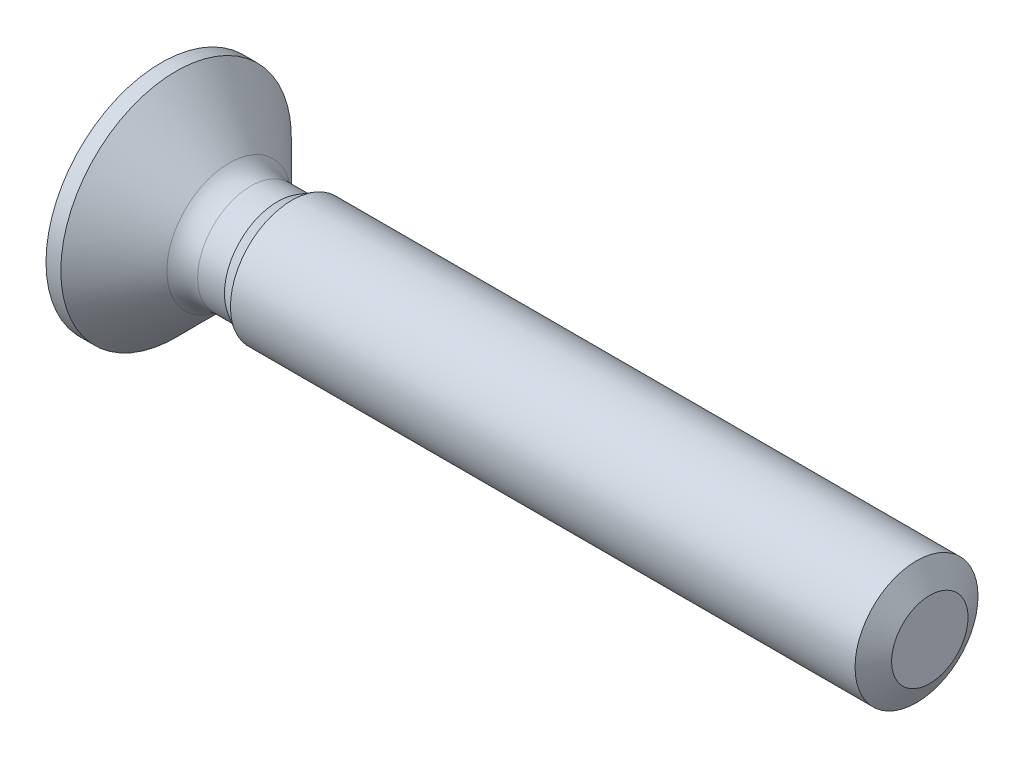
ISO-10303-21;
HEADER;
FILE_DESCRIPTION(('STEP AP214'),'2;1');
FILE_NAME('part.step','',(''),(''),'','','');
FILE_SCHEMA(('AUTOMOTIVE_DESIGN { 1 0 10303 214 1 1 1 1 }'));
ENDSEC;
DATA;
#1=APPLICATION_CONTEXT('core data for automotive mechanical design processes');
#2=APPLICATION_PROTOCOL_DEFINITION('international standard','automotive_design',2000,#1);
#3=PRODUCT_CONTEXT('',#1,'mechanical');
#4=PRODUCT('Part','Part','',(#3));
#5=PRODUCT_RELATED_PRODUCT_CATEGORY('part','',(#4));
#6=PRODUCT_DEFINITION_FORMATION('','',#4);
#7=PRODUCT_DEFINITION_CONTEXT('part definition',#1,'design');
#8=PRODUCT_DEFINITION('design','',#6,#7);
#9=PRODUCT_DEFINITION_SHAPE('','',#8);
#10=(LENGTH_UNIT() NAMED_UNIT(*) SI_UNIT(.MILLI.,.METRE.));
#11=(NAMED_UNIT(*) PLANE_ANGLE_UNIT() SI_UNIT($,.RADIAN.));
#12=(NAMED_UNIT(*) SI_UNIT($,.STERADIAN.) SOLID_ANGLE_UNIT());
#13=UNCERTAINTY_MEASURE_WITH_UNIT(LENGTH_MEASURE(1.E-05),#10,'distance_accuracy_value','');
#14=(GEOMETRIC_REPRESENTATION_CONTEXT(3) GLOBAL_UNCERTAINTY_ASSIGNED_CONTEXT((#13)) GLOBAL_UNIT_ASSIGNED_CONTEXT((#10,
#11,#12)) REPRESENTATION_CONTEXT('',''));
#15=CARTESIAN_POINT('',(0.,0.,0.));
#16=DIRECTION('',(0.,0.,1.));
#17=DIRECTION('',(1.,0.,0.));
#18=AXIS2_PLACEMENT_3D('',#15,#16,#17);
#19=CARTESIAN_POINT('',(0.,0.,0.));
#20=DIRECTION('',(1.,0.,0.));
#21=DIRECTION('',(0.,0.,-1.));
#22=AXIS2_PLACEMENT_3D('',#19,#20,#21);
#23=PLANE('',#22);
#24=CARTESIAN_POINT('',(0.,0.,0.));
#25=DIRECTION('',(-1.,0.,0.));
#26=DIRECTION('',(0.,0.,1.));
#27=AXIS2_PLACEMENT_3D('',#24,#25,#26);
#28=CIRCLE('',#27,1.5);
#29=CARTESIAN_POINT('',(0.,0.,1.5));
#30=VERTEX_POINT('',#29);
#31=EDGE_CURVE('E182',#30,#30,#28,.T.);
#32=ORIENTED_EDGE('',*,*,#31,.T.);
#33=EDGE_LOOP('',(#32));
#34=FACE_BOUND('',#33,.T.);
#35=DIRECTION('',(0.,1.,0.));
#36=VECTOR('',#35,1.);
#37=CARTESIAN_POINT('',(0.,0.799999999999999,0.175000000000003));
#38=LINE('',#37,#36);
#39=CARTESIAN_POINT('',(0.,0.175,0.175000000000001));
#40=VERTEX_POINT('',#39);
#41=CARTESIAN_POINT('',(0.,0.799999999999999,0.175000000000003));
#42=VERTEX_POINT('',#41);
#43=EDGE_CURVE('E104',#40,#42,#38,.T.);
#44=ORIENTED_EDGE('',*,*,#43,.F.);
#45=DIRECTION('',(0.,0.,-1.));
#46=VECTOR('',#45,1.);
#47=CARTESIAN_POINT('',(0.,0.175,-0.8));
#48=LINE('',#47,#46);
#49=CARTESIAN_POINT('',(0.,0.175,0.8));
#50=VERTEX_POINT('',#49);
#51=EDGE_CURVE('E149',#50,#40,#48,.T.);
#52=ORIENTED_EDGE('',*,*,#51,.F.);
#53=DIRECTION('',(0.,1.,0.));
#54=VECTOR('',#53,1.);
#55=CARTESIAN_POINT('',(0.,0.175,0.8));
#56=LINE('',#55,#54);
#57=CARTESIAN_POINT('',(0.,-0.175,0.8));
#58=VERTEX_POINT('',#57);
#59=EDGE_CURVE('E146',#58,#50,#56,.T.);
#60=ORIENTED_EDGE('',*,*,#59,.F.);
#61=DIRECTION('',(0.,0.,1.));
#62=VECTOR('',#61,1.);
#63=CARTESIAN_POINT('',(0.,-0.175,-0.8));
#64=LINE('',#63,#62);
#65=CARTESIAN_POINT('',(0.,-0.175,0.174999999999999));
#66=VERTEX_POINT('',#65);
#67=EDGE_CURVE('E77',#66,#58,#64,.T.);
#68=ORIENTED_EDGE('',*,*,#67,.F.);
#69=CARTESIAN_POINT('',(0.,-0.800000000000001,0.174999999999997));
#70=VERTEX_POINT('',#69);
#71=EDGE_CURVE('E112',#70,#66,#38,.T.);
#72=ORIENTED_EDGE('',*,*,#71,.F.);
#73=DIRECTION('',(0.,0.,1.));
#74=VECTOR('',#73,1.);
#75=CARTESIAN_POINT('',(0.,-0.800000000000001,0.174999999999997));
#76=LINE('',#75,#74);
#77=CARTESIAN_POINT('',(0.,-0.799999999999999,-0.175000000000003));
#78=VERTEX_POINT('',#77);
#79=EDGE_CURVE('E113',#78,#70,#76,.T.);
#80=ORIENTED_EDGE('',*,*,#79,.F.);
#81=DIRECTION('',(0.,-1.,0.));
#82=VECTOR('',#81,1.);
#83=CARTESIAN_POINT('',(0.,0.800000000000001,-0.174999999999997));
#84=LINE('',#83,#82);
#85=CARTESIAN_POINT('',(0.,-0.175,-0.175000000000001));
#86=VERTEX_POINT('',#85);
#87=EDGE_CURVE('E126',#86,#78,#84,.T.);
#88=ORIENTED_EDGE('',*,*,#87,.F.);
#89=CARTESIAN_POINT('',(0.,-0.175,-0.8));
#90=VERTEX_POINT('',#89);
#91=EDGE_CURVE('E143',#90,#86,#64,.T.);
#92=ORIENTED_EDGE('',*,*,#91,.F.);
#93=DIRECTION('',(0.,-1.,0.));
#94=VECTOR('',#93,1.);
#95=CARTESIAN_POINT('',(0.,0.175,-0.8));
#96=LINE('',#95,#94);
#97=CARTESIAN_POINT('',(0.,0.175,-0.8));
#98=VERTEX_POINT('',#97);
#99=EDGE_CURVE('E54',#98,#90,#96,.T.);
#100=ORIENTED_EDGE('',*,*,#99,.F.);
#101=CARTESIAN_POINT('',(0.,0.175,-0.174999999999999));
#102=VERTEX_POINT('',#101);
#103=EDGE_CURVE('E152',#102,#98,#48,.T.);
#104=ORIENTED_EDGE('',*,*,#103,.F.);
#105=CARTESIAN_POINT('',(0.,0.800000000000001,-0.174999999999997));
#106=VERTEX_POINT('',#105);
#107=EDGE_CURVE('E125',#106,#102,#84,.T.);
#108=ORIENTED_EDGE('',*,*,#107,.F.);
#109=DIRECTION('',(0.,0.,-1.));
#110=VECTOR('',#109,1.);
#111=CARTESIAN_POINT('',(0.,0.799999999999999,0.175000000000003));
#112=LINE('',#111,#110);
#113=EDGE_CURVE('E118',#42,#106,#112,.T.);
#114=ORIENTED_EDGE('',*,*,#113,.F.);
#115=EDGE_LOOP('',(#44,#52,#60,#68,#72,#80,#88,#92,#100,#104,#108,#114));
#116=FACE_BOUND('',#115,.T.);
#117=ADVANCED_FACE('F40',(#34,#116),#23,.F.);
#118=CARTESIAN_POINT('',(0.9,0.,0.));
#119=DIRECTION('',(-0.190869659102224,-0.981615389668581,0.));
#120=DIRECTION('',(0.981615389668581,-0.190869659102224,0.));
#121=AXIS2_PLACEMENT_3D('',#118,#119,#120);
#122=PLANE('',#121);
#123=ORIENTED_EDGE('',*,*,#51,.T.);
#124=DIRECTION('',(0.964208851210044,-0.187485054401953,-0.187485054401954));
#125=VECTOR('',#124,1.);
#126=CARTESIAN_POINT('',(0.9,0.,0.));
#127=LINE('',#126,#125);
#128=CARTESIAN_POINT('',(0.9,0.,0.));
#129=VERTEX_POINT('',#128);
#130=EDGE_CURVE('E83',#40,#129,#127,.T.);
#131=ORIENTED_EDGE('',*,*,#130,.T.);
#132=DIRECTION('',(0.739639285522949,-0.143818749962796,-0.657457142687066));
#133=VECTOR('',#132,1.);
#134=CARTESIAN_POINT('',(0.,0.175,0.8));
#135=LINE('',#134,#133);
#136=EDGE_CURVE('E63',#50,#129,#135,.T.);
#137=ORIENTED_EDGE('',*,*,#136,.F.);
#138=EDGE_LOOP('',(#123,#131,#137));
#139=FACE_BOUND('',#138,.T.);
#140=ADVANCED_FACE('F198',(#139),#122,.T.);
#141=DIRECTION('',(0.739639285522949,-0.143818749962796,0.657457142687066));
#142=VECTOR('',#141,1.);
#143=CARTESIAN_POINT('',(0.,0.175,-0.8));
#144=LINE('',#143,#142);
#145=EDGE_CURVE('E148',#98,#129,#144,.T.);
#146=ORIENTED_EDGE('',*,*,#145,.T.);
#147=DIRECTION('',(-0.964208851210045,0.187485054401953,-0.187485054401952));
#148=VECTOR('',#147,1.);
#149=CARTESIAN_POINT('',(0.9,0.,0.));
#150=LINE('',#149,#148);
#151=EDGE_CURVE('E130',#129,#102,#150,.T.);
#152=ORIENTED_EDGE('',*,*,#151,.T.);
#153=ORIENTED_EDGE('',*,*,#103,.T.);
#154=EDGE_LOOP('',(#146,#152,#153));
#155=FACE_BOUND('',#154,.T.);
#156=ADVANCED_FACE('F192',(#155),#122,.T.);
#157=CARTESIAN_POINT('',(0.9,0.,0.));
#158=DIRECTION('',(-0.190869659102224,0.981615389668581,0.));
#159=DIRECTION('',(-0.981615389668581,-0.190869659102224,0.));
#160=AXIS2_PLACEMENT_3D('',#157,#158,#159);
#161=PLANE('',#160);
#162=DIRECTION('',(0.739639285522949,0.143818749962796,-0.657457142687066));
#163=VECTOR('',#162,1.);
#164=CARTESIAN_POINT('',(0.,-0.175,0.8));
#165=LINE('',#164,#163);
#166=EDGE_CURVE('E142',#58,#129,#165,.T.);
#167=ORIENTED_EDGE('',*,*,#166,.T.);
#168=DIRECTION('',(-0.964208851210045,-0.187485054401953,0.187485054401952));
#169=VECTOR('',#168,1.);
#170=CARTESIAN_POINT('',(0.9,0.,0.));
#171=LINE('',#170,#169);
#172=EDGE_CURVE('E11',#129,#66,#171,.T.);
#173=ORIENTED_EDGE('',*,*,#172,.T.);
#174=ORIENTED_EDGE('',*,*,#67,.T.);
#175=EDGE_LOOP('',(#167,#173,#174));
#176=FACE_BOUND('',#175,.T.);
#177=ADVANCED_FACE('F193',(#176),#161,.T.);
#178=ORIENTED_EDGE('',*,*,#91,.T.);
#179=DIRECTION('',(0.964208851210044,0.187485054401953,0.187485054401954));
#180=VECTOR('',#179,1.);
#181=CARTESIAN_POINT('',(0.9,0.,0.));
#182=LINE('',#181,#180);
#183=EDGE_CURVE('E47',#86,#129,#182,.T.);
#184=ORIENTED_EDGE('',*,*,#183,.T.);
#185=DIRECTION('',(0.739639285522949,0.143818749962796,0.657457142687066));
#186=VECTOR('',#185,1.);
#187=CARTESIAN_POINT('',(0.,-0.175,-0.8));
#188=LINE('',#187,#186);
#189=EDGE_CURVE('E157',#90,#129,#188,.T.);
#190=ORIENTED_EDGE('',*,*,#189,.F.);
#191=EDGE_LOOP('',(#178,#184,#190));
#192=FACE_BOUND('',#191,.T.);
#193=ADVANCED_FACE('F186',(#192),#161,.T.);
#194=CARTESIAN_POINT('',(0.,0.,0.));
#195=DIRECTION('',(-1.,0.,0.));
#196=DIRECTION('',(0.,0.,1.));
#197=AXIS2_PLACEMENT_3D('',#194,#195,#196);
#198=CYLINDRICAL_SURFACE('',#197,1.5);
#199=ORIENTED_EDGE('',*,*,#31,.F.);
#200=EDGE_LOOP('',(#199));
#201=FACE_BOUND('',#200,.T.);
#202=CARTESIAN_POINT('',(0.192800000000003,0.,0.));
#203=DIRECTION('',(-1.,0.,0.));
#204=DIRECTION('',(0.,0.,1.));
#205=AXIS2_PLACEMENT_3D('',#202,#203,#204);
#206=CIRCLE('',#205,1.5);
#207=CARTESIAN_POINT('',(0.192800000000003,0.,1.5));
#208=VERTEX_POINT('',#207);
#209=EDGE_CURVE('E178',#208,#208,#206,.T.);
#210=ORIENTED_EDGE('',*,*,#209,.T.);
#211=EDGE_LOOP('',(#210));
#212=FACE_BOUND('',#211,.T.);
#213=ADVANCED_FACE('F226',(#201,#212),#198,.T.);
#214=CARTESIAN_POINT('',(0.882842712474619,0.,0.));
#215=DIRECTION('',(-1.,0.,0.));
#216=DIRECTION('',(0.,0.,1.));
#217=AXIS2_PLACEMENT_3D('',#214,#215,#216);
#218=CONICAL_SURFACE('',#217,0.809957287525381,0.78539816339745);
#219=ORIENTED_EDGE('',*,*,#209,.F.);
#220=EDGE_LOOP('',(#219));
#221=FACE_BOUND('',#220,.T.);
#222=CARTESIAN_POINT('',(0.882842712474619,0.,0.));
#223=DIRECTION('',(-1.,0.,0.));
#224=DIRECTION('',(0.,0.,1.));
#225=AXIS2_PLACEMENT_3D('',#222,#223,#224);
#226=CIRCLE('',#225,0.809957287525381);
#227=CARTESIAN_POINT('',(0.882842712474619,0.,0.809957287525381));
#228=VERTEX_POINT('',#227);
#229=EDGE_CURVE('E174',#228,#228,#226,.T.);
#230=ORIENTED_EDGE('',*,*,#229,.T.);
#231=EDGE_LOOP('',(#230));
#232=FACE_BOUND('',#231,.T.);
#233=ADVANCED_FACE('F229',(#221,#232),#218,.T.);
#234=CARTESIAN_POINT('',(1.16568542494924,0.,0.));
#235=DIRECTION('',(-1.,0.,0.));
#236=DIRECTION('',(0.,0.,1.));
#237=AXIS2_PLACEMENT_3D('',#234,#235,#236);
#238=TOROIDAL_SURFACE('',#237,1.0928,0.4);
#239=ORIENTED_EDGE('',*,*,#229,.F.);
#240=EDGE_LOOP('',(#239));
#241=FACE_BOUND('',#240,.T.);
#242=CARTESIAN_POINT('',(1.16568542494924,0.,0.));
#243=DIRECTION('',(-1.,0.,0.));
#244=DIRECTION('',(0.,0.,1.));
#245=AXIS2_PLACEMENT_3D('',#242,#243,#244);
#246=CIRCLE('',#245,0.6928);
#247=CARTESIAN_POINT('',(1.16568542494924,0.,0.6928));
#248=VERTEX_POINT('',#247);
#249=EDGE_CURVE('E171',#248,#248,#246,.T.);
#250=ORIENTED_EDGE('',*,*,#249,.T.);
#251=EDGE_LOOP('',(#250));
#252=FACE_BOUND('',#251,.T.);
#253=ADVANCED_FACE('F234',(#241,#252),#238,.F.);
#254=CARTESIAN_POINT('',(0.,0.,0.));
#255=DIRECTION('',(-1.,0.,0.));
#256=DIRECTION('',(0.,0.,1.));
#257=AXIS2_PLACEMENT_3D('',#254,#255,#256);
#258=CYLINDRICAL_SURFACE('',#257,0.6928);
#259=ORIENTED_EDGE('',*,*,#249,.F.);
#260=EDGE_LOOP('',(#259));
#261=FACE_BOUND('',#260,.T.);
#262=CARTESIAN_POINT('',(1.51432415342862,0.,0.));
#263=DIRECTION('',(-1.,0.,0.));
#264=DIRECTION('',(0.,0.,1.));
#265=AXIS2_PLACEMENT_3D('',#262,#263,#264);
#266=CIRCLE('',#265,0.6928);
#267=CARTESIAN_POINT('',(1.51432415342862,0.,0.6928));
#268=VERTEX_POINT('',#267);
#269=EDGE_CURVE('E168',#268,#268,#266,.T.);
#270=ORIENTED_EDGE('',*,*,#269,.T.);
#271=EDGE_LOOP('',(#270));
#272=FACE_BOUND('',#271,.T.);
#273=ADVANCED_FACE('F240',(#261,#272),#258,.T.);
#274=CARTESIAN_POINT('',(1.7,0.,0.));
#275=DIRECTION('',(1.,0.,0.));
#276=DIRECTION('',(0.,0.,-1.));
#277=AXIS2_PLACEMENT_3D('',#274,#275,#276);
#278=CONICAL_SURFACE('',#277,0.8,0.5235987755983);
#279=ORIENTED_EDGE('',*,*,#269,.F.);
#280=EDGE_LOOP('',(#279));
#281=FACE_BOUND('',#280,.T.);
#282=CARTESIAN_POINT('',(1.7,0.,0.));
#283=DIRECTION('',(-1.,0.,0.));
#284=DIRECTION('',(0.,0.,1.));
#285=AXIS2_PLACEMENT_3D('',#282,#283,#284);
#286=CIRCLE('',#285,0.8);
#287=CARTESIAN_POINT('',(1.7,0.,0.8));
#288=VERTEX_POINT('',#287);
#289=EDGE_CURVE('E165',#288,#288,#286,.T.);
#290=ORIENTED_EDGE('',*,*,#289,.T.);
#291=EDGE_LOOP('',(#290));
#292=FACE_BOUND('',#291,.T.);
#293=ADVANCED_FACE('F246',(#281,#292),#278,.T.);
#294=CARTESIAN_POINT('',(0.,0.,0.));
#295=DIRECTION('',(-1.,0.,0.));
#296=DIRECTION('',(0.,0.,1.));
#297=AXIS2_PLACEMENT_3D('',#294,#295,#296);
#298=CYLINDRICAL_SURFACE('',#297,0.8);
#299=CARTESIAN_POINT('',(9.8268956020098,0.,0.));
#300=DIRECTION('',(1.,0.,0.));
#301=DIRECTION('',(0.,0.,-1.));
#302=AXIS2_PLACEMENT_3D('',#299,#300,#301);
#303=CIRCLE('',#302,0.799999999999999);
#304=CARTESIAN_POINT('',(9.8268956020098,0.,-0.799999999999999));
#305=VERTEX_POINT('',#304);
#306=EDGE_CURVE('E162',#305,#305,#303,.T.);
#307=ORIENTED_EDGE('',*,*,#306,.F.);
#308=EDGE_LOOP('',(#307));
#309=FACE_BOUND('',#308,.T.);
#310=ORIENTED_EDGE('',*,*,#289,.F.);
#311=EDGE_LOOP('',(#310));
#312=FACE_BOUND('',#311,.T.);
#313=ADVANCED_FACE('F252',(#309,#312),#298,.T.);
#314=CARTESIAN_POINT('',(9.8268956020098,0.,0.));
#315=DIRECTION('',(-1.,0.,0.));
#316=DIRECTION('',(0.,0.,1.));
#317=AXIS2_PLACEMENT_3D('',#314,#315,#316);
#318=CONICAL_SURFACE('',#317,0.799999999999999,1.05188801855118);
#319=CARTESIAN_POINT('',(10.,0.,0.));
#320=DIRECTION('',(1.,0.,0.));
#321=DIRECTION('',(0.,0.,-1.));
#322=AXIS2_PLACEMENT_3D('',#319,#320,#321);
#323=CIRCLE('',#322,0.496899999999999);
#324=CARTESIAN_POINT('',(10.,0.,-0.496899999999999));
#325=VERTEX_POINT('',#324);
#326=EDGE_CURVE('E151',#325,#325,#323,.T.);
#327=ORIENTED_EDGE('',*,*,#326,.F.);
#328=EDGE_LOOP('',(#327));
#329=FACE_BOUND('',#328,.T.);
#330=ORIENTED_EDGE('',*,*,#306,.T.);
#331=EDGE_LOOP('',(#330));
#332=FACE_BOUND('',#331,.T.);
#333=ADVANCED_FACE('F257',(#329,#332),#318,.T.);
#334=CARTESIAN_POINT('',(10.,0.8,0.));
#335=DIRECTION('',(-1.,0.,0.));
#336=DIRECTION('',(0.,0.,1.));
#337=AXIS2_PLACEMENT_3D('',#334,#335,#336);
#338=PLANE('',#337);
#339=ORIENTED_EDGE('',*,*,#326,.T.);
#340=EDGE_LOOP('',(#339));
#341=FACE_BOUND('',#340,.T.);
#342=ADVANCED_FACE('F263',(#341),#338,.F.);
#343=CARTESIAN_POINT('',(0.,0.175,-0.8));
#344=DIRECTION('',(0.66436383882992,0.,-0.74740931868366));
#345=DIRECTION('',(-0.74740931868366,0.,-0.66436383882992));
#346=AXIS2_PLACEMENT_3D('',#343,#344,#345);
#347=PLANE('',#346);
#348=ORIENTED_EDGE('',*,*,#145,.F.);
#349=ORIENTED_EDGE('',*,*,#99,.T.);
#350=ORIENTED_EDGE('',*,*,#189,.T.);
#351=EDGE_LOOP('',(#348,#349,#350));
#352=FACE_BOUND('',#351,.T.);
#353=ADVANCED_FACE('F190',(#352),#347,.F.);
#354=CARTESIAN_POINT('',(0.,-0.175,0.8));
#355=DIRECTION('',(0.66436383882992,0.,0.74740931868366));
#356=DIRECTION('',(0.74740931868366,0.,-0.66436383882992));
#357=AXIS2_PLACEMENT_3D('',#354,#355,#356);
#358=PLANE('',#357);
#359=ORIENTED_EDGE('',*,*,#166,.F.);
#360=ORIENTED_EDGE('',*,*,#59,.T.);
#361=ORIENTED_EDGE('',*,*,#136,.T.);
#362=EDGE_LOOP('',(#359,#360,#361));
#363=FACE_BOUND('',#362,.T.);
#364=ADVANCED_FACE('F197',(#363),#358,.F.);
#365=CARTESIAN_POINT('',(0.9,0.,0.));
#366=DIRECTION('',(-0.190869659102224,0.,-0.981615389668581));
#367=DIRECTION('',(0.981615389668581,0.,-0.190869659102224));
#368=AXIS2_PLACEMENT_3D('',#365,#366,#367);
#369=PLANE('',#368);
#370=DIRECTION('',(0.739639285522949,0.657457142687066,-0.143818749962793));
#371=VECTOR('',#370,1.);
#372=CARTESIAN_POINT('',(0.,-0.800000000000001,0.174999999999997));
#373=LINE('',#372,#371);
#374=EDGE_CURVE('E122',#70,#129,#373,.T.);
#375=ORIENTED_EDGE('',*,*,#374,.F.);
#376=ORIENTED_EDGE('',*,*,#71,.T.);
#377=ORIENTED_EDGE('',*,*,#172,.F.);
#378=EDGE_LOOP('',(#375,#376,#377));
#379=FACE_BOUND('',#378,.T.);
#380=ADVANCED_FACE('F202',(#379),#369,.T.);
#381=CARTESIAN_POINT('',(0.9,0.,0.));
#382=DIRECTION('',(-0.190869659102224,0.,0.981615389668581));
#383=DIRECTION('',(-0.981615389668581,0.,-0.190869659102224));
#384=AXIS2_PLACEMENT_3D('',#381,#382,#383);
#385=PLANE('',#384);
#386=ORIENTED_EDGE('',*,*,#87,.T.);
#387=DIRECTION('',(0.739639285522949,0.657457142687065,0.143818749962798));
#388=VECTOR('',#387,1.);
#389=CARTESIAN_POINT('',(0.,-0.799999999999999,-0.175000000000003));
#390=LINE('',#389,#388);
#391=EDGE_CURVE('E136',#78,#129,#390,.T.);
#392=ORIENTED_EDGE('',*,*,#391,.T.);
#393=ORIENTED_EDGE('',*,*,#183,.F.);
#394=EDGE_LOOP('',(#386,#392,#393));
#395=FACE_BOUND('',#394,.T.);
#396=ADVANCED_FACE('F206',(#395),#385,.T.);
#397=CARTESIAN_POINT('',(0.,-0.799999999999999,-0.175000000000003));
#398=DIRECTION('',(0.66436383882992,-0.74740931868366,0.));
#399=DIRECTION('',(0.74740931868366,0.66436383882992,0.));
#400=AXIS2_PLACEMENT_3D('',#397,#398,#399);
#401=PLANE('',#400);
#402=ORIENTED_EDGE('',*,*,#391,.F.);
#403=ORIENTED_EDGE('',*,*,#79,.T.);
#404=ORIENTED_EDGE('',*,*,#374,.T.);
#405=EDGE_LOOP('',(#402,#403,#404));
#406=FACE_BOUND('',#405,.T.);
#407=ADVANCED_FACE('F205',(#406),#401,.F.);
#408=ORIENTED_EDGE('',*,*,#43,.T.);
#409=DIRECTION('',(0.739639285522949,-0.657457142687065,-0.143818749962798));
#410=VECTOR('',#409,1.);
#411=CARTESIAN_POINT('',(0.,0.799999999999999,0.175000000000003));
#412=LINE('',#411,#410);
#413=EDGE_CURVE('E107',#42,#129,#412,.T.);
#414=ORIENTED_EDGE('',*,*,#413,.T.);
#415=ORIENTED_EDGE('',*,*,#130,.F.);
#416=EDGE_LOOP('',(#408,#414,#415));
#417=FACE_BOUND('',#416,.T.);
#418=ADVANCED_FACE('F106',(#417),#369,.T.);
#419=DIRECTION('',(0.739639285522949,-0.657457142687066,0.143818749962793));
#420=VECTOR('',#419,1.);
#421=CARTESIAN_POINT('',(0.,0.800000000000001,-0.174999999999997));
#422=LINE('',#421,#420);
#423=EDGE_CURVE('E120',#106,#129,#422,.T.);
#424=ORIENTED_EDGE('',*,*,#423,.F.);
#425=ORIENTED_EDGE('',*,*,#107,.T.);
#426=ORIENTED_EDGE('',*,*,#151,.F.);
#427=EDGE_LOOP('',(#424,#425,#426));
#428=FACE_BOUND('',#427,.T.);
#429=ADVANCED_FACE('F209',(#428),#385,.T.);
#430=CARTESIAN_POINT('',(0.,0.799999999999999,0.175000000000003));
#431=DIRECTION('',(0.66436383882992,0.74740931868366,0.));
#432=DIRECTION('',(-0.74740931868366,0.66436383882992,0.));
#433=AXIS2_PLACEMENT_3D('',#430,#431,#432);
#434=PLANE('',#433);
#435=ORIENTED_EDGE('',*,*,#413,.F.);
#436=ORIENTED_EDGE('',*,*,#113,.T.);
#437=ORIENTED_EDGE('',*,*,#423,.T.);
#438=EDGE_LOOP('',(#435,#436,#437));
#439=FACE_BOUND('',#438,.T.);
#440=ADVANCED_FACE('F117',(#439),#434,.F.);
#441=CLOSED_SHELL('',(#117,#140,#156,#177,#193,#213,#233,#253,#273,#293,#313,#333,#342,#353,
#364,#380,#396,#407,#418,#429,#440));
#442=MANIFOLD_SOLID_BREP('B2',#441);
#443=ADVANCED_BREP_SHAPE_REPRESENTATION('',(#18,#442),#14);
#444=SHAPE_DEFINITION_REPRESENTATION(#9,#443);
ENDSEC;
END-ISO-10303-21;
